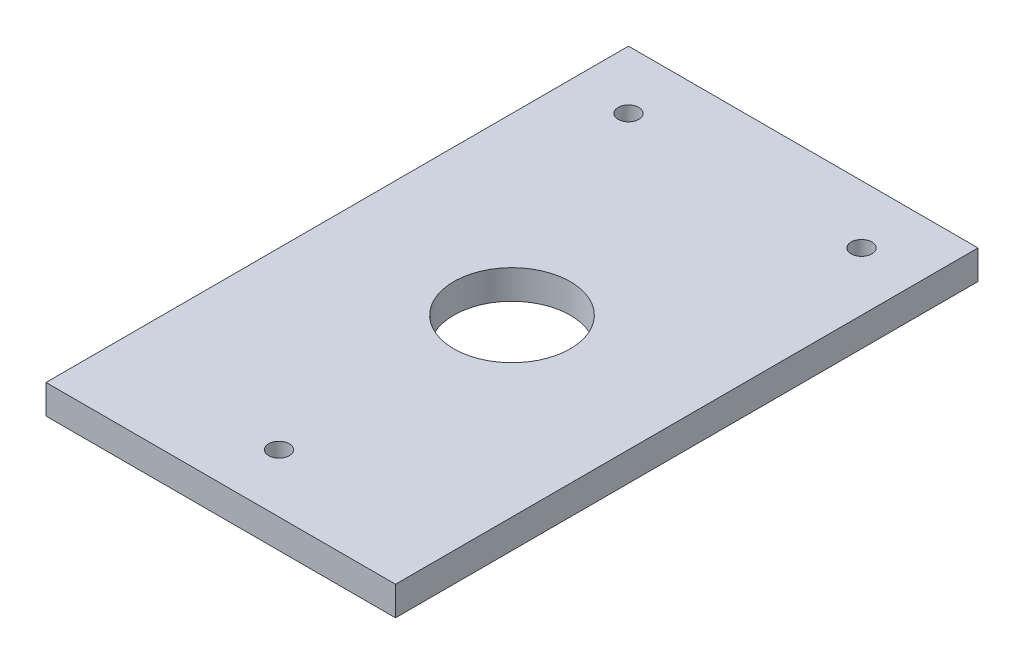
ISO-10303-21;
HEADER;
FILE_DESCRIPTION(('STEP AP214'),'2;1');
FILE_NAME('part.step','',(''),(''),'','','');
FILE_SCHEMA(('AUTOMOTIVE_DESIGN { 1 0 10303 214 1 1 1 1 }'));
ENDSEC;
DATA;
#1=APPLICATION_CONTEXT('core data for automotive mechanical design processes');
#2=APPLICATION_PROTOCOL_DEFINITION('international standard','automotive_design',2000,#1);
#3=PRODUCT_CONTEXT('',#1,'mechanical');
#4=PRODUCT('Part','Part','',(#3));
#5=PRODUCT_RELATED_PRODUCT_CATEGORY('part','',(#4));
#6=PRODUCT_DEFINITION_FORMATION('','',#4);
#7=PRODUCT_DEFINITION_CONTEXT('part definition',#1,'design');
#8=PRODUCT_DEFINITION('design','',#6,#7);
#9=PRODUCT_DEFINITION_SHAPE('','',#8);
#10=(LENGTH_UNIT() NAMED_UNIT(*) SI_UNIT(.MILLI.,.METRE.));
#11=(NAMED_UNIT(*) PLANE_ANGLE_UNIT() SI_UNIT($,.RADIAN.));
#12=(NAMED_UNIT(*) SI_UNIT($,.STERADIAN.) SOLID_ANGLE_UNIT());
#13=UNCERTAINTY_MEASURE_WITH_UNIT(LENGTH_MEASURE(1.E-05),#10,'distance_accuracy_value','');
#14=(GEOMETRIC_REPRESENTATION_CONTEXT(3) GLOBAL_UNCERTAINTY_ASSIGNED_CONTEXT((#13)) GLOBAL_UNIT_ASSIGNED_CONTEXT((#10,
#11,#12)) REPRESENTATION_CONTEXT('',''));
#15=CARTESIAN_POINT('',(0.,0.,0.));
#16=DIRECTION('',(0.,0.,1.));
#17=DIRECTION('',(1.,0.,0.));
#18=AXIS2_PLACEMENT_3D('',#15,#16,#17);
#19=CARTESIAN_POINT('',(0.,3.175,0.));
#20=DIRECTION('',(0.,1.,0.));
#21=DIRECTION('',(0.,0.,1.));
#22=AXIS2_PLACEMENT_3D('',#19,#20,#21);
#23=PLANE('',#22);
#24=CARTESIAN_POINT('',(-12.7,3.175,222.25));
#25=DIRECTION('',(0.,-1.,0.));
#26=DIRECTION('',(0.,0.,-1.));
#27=AXIS2_PLACEMENT_3D('',#24,#25,#26);
#28=CIRCLE('',#27,1.1303);
#29=CARTESIAN_POINT('',(-12.7,3.175,221.1197));
#30=VERTEX_POINT('',#29);
#31=EDGE_CURVE('E131',#30,#30,#28,.T.);
#32=ORIENTED_EDGE('',*,*,#31,.T.);
#33=EDGE_LOOP('',(#32));
#34=FACE_BOUND('',#33,.T.);
#35=CARTESIAN_POINT('',(12.7,3.175,222.25));
#36=DIRECTION('',(0.,-1.,0.));
#37=DIRECTION('',(0.,0.,-1.));
#38=AXIS2_PLACEMENT_3D('',#35,#36,#37);
#39=CIRCLE('',#38,1.1303);
#40=CARTESIAN_POINT('',(12.7,3.175,221.1197));
#41=VERTEX_POINT('',#40);
#42=EDGE_CURVE('E125',#41,#41,#39,.T.);
#43=ORIENTED_EDGE('',*,*,#42,.T.);
#44=EDGE_LOOP('',(#43));
#45=FACE_BOUND('',#44,.T.);
#46=CARTESIAN_POINT('',(0.,3.175,273.05));
#47=DIRECTION('',(0.,-1.,0.));
#48=DIRECTION('',(0.,0.,-1.));
#49=AXIS2_PLACEMENT_3D('',#46,#47,#48);
#50=CIRCLE('',#49,1.1303);
#51=CARTESIAN_POINT('',(0.,3.175,271.9197));
#52=VERTEX_POINT('',#51);
#53=EDGE_CURVE('E117',#52,#52,#50,.T.);
#54=ORIENTED_EDGE('',*,*,#53,.T.);
#55=EDGE_LOOP('',(#54));
#56=FACE_BOUND('',#55,.T.);
#57=DIRECTION('',(0.,0.,-1.));
#58=VECTOR('',#57,1.);
#59=CARTESIAN_POINT('',(19.05,3.175,279.4));
#60=LINE('',#59,#58);
#61=CARTESIAN_POINT('',(19.05,3.175,279.4));
#62=VERTEX_POINT('',#61);
#63=CARTESIAN_POINT('',(19.05,3.175,215.9));
#64=VERTEX_POINT('',#63);
#65=EDGE_CURVE('E87',#62,#64,#60,.T.);
#66=ORIENTED_EDGE('',*,*,#65,.T.);
#67=DIRECTION('',(-1.,0.,0.));
#68=VECTOR('',#67,1.);
#69=CARTESIAN_POINT('',(19.05,3.175,215.9));
#70=LINE('',#69,#68);
#71=CARTESIAN_POINT('',(-19.05,3.175,215.9));
#72=VERTEX_POINT('',#71);
#73=EDGE_CURVE('E82',#64,#72,#70,.T.);
#74=ORIENTED_EDGE('',*,*,#73,.T.);
#75=DIRECTION('',(0.,0.,1.));
#76=VECTOR('',#75,1.);
#77=CARTESIAN_POINT('',(-19.05,3.175,279.4));
#78=LINE('',#77,#76);
#79=CARTESIAN_POINT('',(-19.05,3.175,279.4));
#80=VERTEX_POINT('',#79);
#81=EDGE_CURVE('E85',#72,#80,#78,.T.);
#82=ORIENTED_EDGE('',*,*,#81,.T.);
#83=DIRECTION('',(1.,0.,0.));
#84=VECTOR('',#83,1.);
#85=CARTESIAN_POINT('',(19.05,3.175,279.4));
#86=LINE('',#85,#84);
#87=EDGE_CURVE('E52',#80,#62,#86,.T.);
#88=ORIENTED_EDGE('',*,*,#87,.T.);
#89=EDGE_LOOP('',(#66,#74,#82,#88));
#90=FACE_BOUND('',#89,.T.);
#91=CARTESIAN_POINT('',(0.,3.175,247.65));
#92=DIRECTION('',(0.,1.,0.));
#93=DIRECTION('',(0.,0.,1.));
#94=AXIS2_PLACEMENT_3D('',#91,#92,#93);
#95=CIRCLE('',#94,6.35);
#96=CARTESIAN_POINT('',(0.,3.175,254.));
#97=VERTEX_POINT('',#96);
#98=EDGE_CURVE('E102',#97,#97,#95,.T.);
#99=ORIENTED_EDGE('',*,*,#98,.F.);
#100=EDGE_LOOP('',(#99));
#101=FACE_BOUND('',#100,.T.);
#102=ADVANCED_FACE('F35',(#34,#45,#56,#90,#101),#23,.T.);
#103=CARTESIAN_POINT('',(0.,0.,0.));
#104=DIRECTION('',(0.,1.,0.));
#105=DIRECTION('',(0.,0.,1.));
#106=AXIS2_PLACEMENT_3D('',#103,#104,#105);
#107=PLANE('',#106);
#108=CARTESIAN_POINT('',(-12.7,0.,222.25));
#109=DIRECTION('',(0.,-1.,0.));
#110=DIRECTION('',(0.,0.,-1.));
#111=AXIS2_PLACEMENT_3D('',#108,#109,#110);
#112=CIRCLE('',#111,1.13029999999999);
#113=CARTESIAN_POINT('',(-12.7,0.,221.1197));
#114=VERTEX_POINT('',#113);
#115=EDGE_CURVE('E134',#114,#114,#112,.T.);
#116=ORIENTED_EDGE('',*,*,#115,.F.);
#117=EDGE_LOOP('',(#116));
#118=FACE_BOUND('',#117,.T.);
#119=CARTESIAN_POINT('',(12.7,0.,222.25));
#120=DIRECTION('',(0.,-1.,0.));
#121=DIRECTION('',(0.,0.,-1.));
#122=AXIS2_PLACEMENT_3D('',#119,#120,#121);
#123=CIRCLE('',#122,1.13029999999999);
#124=CARTESIAN_POINT('',(12.7,0.,221.1197));
#125=VERTEX_POINT('',#124);
#126=EDGE_CURVE('E128',#125,#125,#123,.T.);
#127=ORIENTED_EDGE('',*,*,#126,.F.);
#128=EDGE_LOOP('',(#127));
#129=FACE_BOUND('',#128,.T.);
#130=CARTESIAN_POINT('',(0.,0.,273.05));
#131=DIRECTION('',(0.,-1.,0.));
#132=DIRECTION('',(0.,0.,-1.));
#133=AXIS2_PLACEMENT_3D('',#130,#131,#132);
#134=CIRCLE('',#133,1.13029999999999);
#135=CARTESIAN_POINT('',(0.,0.,271.9197));
#136=VERTEX_POINT('',#135);
#137=EDGE_CURVE('E122',#136,#136,#134,.T.);
#138=ORIENTED_EDGE('',*,*,#137,.F.);
#139=EDGE_LOOP('',(#138));
#140=FACE_BOUND('',#139,.T.);
#141=DIRECTION('',(0.,0.,-1.));
#142=VECTOR('',#141,1.);
#143=CARTESIAN_POINT('',(19.05,0.,279.4));
#144=LINE('',#143,#142);
#145=CARTESIAN_POINT('',(19.05,0.,279.4));
#146=VERTEX_POINT('',#145);
#147=CARTESIAN_POINT('',(19.05,0.,215.9));
#148=VERTEX_POINT('',#147);
#149=EDGE_CURVE('E99',#146,#148,#144,.T.);
#150=ORIENTED_EDGE('',*,*,#149,.F.);
#151=DIRECTION('',(1.,0.,0.));
#152=VECTOR('',#151,1.);
#153=CARTESIAN_POINT('',(19.05,0.,279.4));
#154=LINE('',#153,#152);
#155=CARTESIAN_POINT('',(-19.05,0.,279.4));
#156=VERTEX_POINT('',#155);
#157=EDGE_CURVE('E75',#156,#146,#154,.T.);
#158=ORIENTED_EDGE('',*,*,#157,.F.);
#159=DIRECTION('',(0.,0.,1.));
#160=VECTOR('',#159,1.);
#161=CARTESIAN_POINT('',(-19.05,0.,279.4));
#162=LINE('',#161,#160);
#163=CARTESIAN_POINT('',(-19.05,0.,215.9));
#164=VERTEX_POINT('',#163);
#165=EDGE_CURVE('E69',#164,#156,#162,.T.);
#166=ORIENTED_EDGE('',*,*,#165,.F.);
#167=DIRECTION('',(-1.,0.,0.));
#168=VECTOR('',#167,1.);
#169=CARTESIAN_POINT('',(19.05,0.,215.9));
#170=LINE('',#169,#168);
#171=EDGE_CURVE('E91',#148,#164,#170,.T.);
#172=ORIENTED_EDGE('',*,*,#171,.F.);
#173=EDGE_LOOP('',(#150,#158,#166,#172));
#174=FACE_BOUND('',#173,.T.);
#175=CARTESIAN_POINT('',(0.,0.,247.65));
#176=DIRECTION('',(0.,1.,0.));
#177=DIRECTION('',(0.,0.,1.));
#178=AXIS2_PLACEMENT_3D('',#175,#176,#177);
#179=CIRCLE('',#178,6.35);
#180=CARTESIAN_POINT('',(0.,0.,254.));
#181=VERTEX_POINT('',#180);
#182=EDGE_CURVE('E114',#181,#181,#179,.T.);
#183=ORIENTED_EDGE('',*,*,#182,.T.);
#184=EDGE_LOOP('',(#183));
#185=FACE_BOUND('',#184,.T.);
#186=ADVANCED_FACE('F110',(#118,#129,#140,#174,#185),#107,.F.);
#187=CARTESIAN_POINT('',(19.05,3.175,279.4));
#188=DIRECTION('',(-1.,0.,0.));
#189=DIRECTION('',(0.,0.,1.));
#190=AXIS2_PLACEMENT_3D('',#187,#188,#189);
#191=PLANE('',#190);
#192=ORIENTED_EDGE('',*,*,#149,.T.);
#193=DIRECTION('',(0.,-1.,0.));
#194=VECTOR('',#193,1.);
#195=CARTESIAN_POINT('',(19.05,3.175,215.9));
#196=LINE('',#195,#194);
#197=EDGE_CURVE('E11',#64,#148,#196,.T.);
#198=ORIENTED_EDGE('',*,*,#197,.F.);
#199=ORIENTED_EDGE('',*,*,#65,.F.);
#200=DIRECTION('',(0.,-1.,0.));
#201=VECTOR('',#200,1.);
#202=CARTESIAN_POINT('',(19.05,3.175,279.4));
#203=LINE('',#202,#201);
#204=EDGE_CURVE('E95',#62,#146,#203,.T.);
#205=ORIENTED_EDGE('',*,*,#204,.T.);
#206=EDGE_LOOP('',(#192,#198,#199,#205));
#207=FACE_BOUND('',#206,.T.);
#208=ADVANCED_FACE('F37',(#207),#191,.F.);
#209=CARTESIAN_POINT('',(19.05,3.175,215.9));
#210=DIRECTION('',(0.,0.,1.));
#211=DIRECTION('',(1.,0.,0.));
#212=AXIS2_PLACEMENT_3D('',#209,#210,#211);
#213=PLANE('',#212);
#214=ORIENTED_EDGE('',*,*,#171,.T.);
#215=DIRECTION('',(0.,-1.,0.));
#216=VECTOR('',#215,1.);
#217=CARTESIAN_POINT('',(-19.05,3.175,215.9));
#218=LINE('',#217,#216);
#219=EDGE_CURVE('E44',#72,#164,#218,.T.);
#220=ORIENTED_EDGE('',*,*,#219,.F.);
#221=ORIENTED_EDGE('',*,*,#73,.F.);
#222=ORIENTED_EDGE('',*,*,#197,.T.);
#223=EDGE_LOOP('',(#214,#220,#221,#222));
#224=FACE_BOUND('',#223,.T.);
#225=ADVANCED_FACE('F90',(#224),#213,.F.);
#226=CARTESIAN_POINT('',(-19.05,3.175,279.4));
#227=DIRECTION('',(1.,0.,0.));
#228=DIRECTION('',(0.,0.,-1.));
#229=AXIS2_PLACEMENT_3D('',#226,#227,#228);
#230=PLANE('',#229);
#231=ORIENTED_EDGE('',*,*,#165,.T.);
#232=DIRECTION('',(0.,-1.,0.));
#233=VECTOR('',#232,1.);
#234=CARTESIAN_POINT('',(-19.05,3.175,279.4));
#235=LINE('',#234,#233);
#236=EDGE_CURVE('E92',#80,#156,#235,.T.);
#237=ORIENTED_EDGE('',*,*,#236,.F.);
#238=ORIENTED_EDGE('',*,*,#81,.F.);
#239=ORIENTED_EDGE('',*,*,#219,.T.);
#240=EDGE_LOOP('',(#231,#237,#238,#239));
#241=FACE_BOUND('',#240,.T.);
#242=ADVANCED_FACE('F93',(#241),#230,.F.);
#243=CARTESIAN_POINT('',(19.05,3.175,279.4));
#244=DIRECTION('',(0.,0.,-1.));
#245=DIRECTION('',(-1.,0.,0.));
#246=AXIS2_PLACEMENT_3D('',#243,#244,#245);
#247=PLANE('',#246);
#248=ORIENTED_EDGE('',*,*,#157,.T.);
#249=ORIENTED_EDGE('',*,*,#204,.F.);
#250=ORIENTED_EDGE('',*,*,#87,.F.);
#251=ORIENTED_EDGE('',*,*,#236,.T.);
#252=EDGE_LOOP('',(#248,#249,#250,#251));
#253=FACE_BOUND('',#252,.T.);
#254=ADVANCED_FACE('F107',(#253),#247,.F.);
#255=CARTESIAN_POINT('',(0.,3.175,247.65));
#256=DIRECTION('',(0.,-1.,0.));
#257=DIRECTION('',(0.,0.,-1.));
#258=AXIS2_PLACEMENT_3D('',#255,#256,#257);
#259=CYLINDRICAL_SURFACE('',#258,6.35);
#260=ORIENTED_EDGE('',*,*,#98,.T.);
#261=EDGE_LOOP('',(#260));
#262=FACE_BOUND('',#261,.T.);
#263=ORIENTED_EDGE('',*,*,#182,.F.);
#264=EDGE_LOOP('',(#263));
#265=FACE_BOUND('',#264,.T.);
#266=ADVANCED_FACE('F150',(#262,#265),#259,.F.);
#267=CARTESIAN_POINT('',(0.,0.,273.05));
#268=DIRECTION('',(0.,-1.,0.));
#269=DIRECTION('',(0.,0.,-1.));
#270=AXIS2_PLACEMENT_3D('',#267,#268,#269);
#271=CYLINDRICAL_SURFACE('',#270,1.13029999999999);
#272=ORIENTED_EDGE('',*,*,#53,.F.);
#273=EDGE_LOOP('',(#272));
#274=FACE_BOUND('',#273,.T.);
#275=ORIENTED_EDGE('',*,*,#137,.T.);
#276=EDGE_LOOP('',(#275));
#277=FACE_BOUND('',#276,.T.);
#278=ADVANCED_FACE('F147',(#274,#277),#271,.F.);
#279=CARTESIAN_POINT('',(12.7,0.,222.25));
#280=DIRECTION('',(0.,-1.,0.));
#281=DIRECTION('',(0.,0.,-1.));
#282=AXIS2_PLACEMENT_3D('',#279,#280,#281);
#283=CYLINDRICAL_SURFACE('',#282,1.13029999999999);
#284=ORIENTED_EDGE('',*,*,#42,.F.);
#285=EDGE_LOOP('',(#284));
#286=FACE_BOUND('',#285,.T.);
#287=ORIENTED_EDGE('',*,*,#126,.T.);
#288=EDGE_LOOP('',(#287));
#289=FACE_BOUND('',#288,.T.);
#290=ADVANCED_FACE('F149',(#286,#289),#283,.F.);
#291=CARTESIAN_POINT('',(-12.7,0.,222.25));
#292=DIRECTION('',(0.,-1.,0.));
#293=DIRECTION('',(0.,0.,-1.));
#294=AXIS2_PLACEMENT_3D('',#291,#292,#293);
#295=CYLINDRICAL_SURFACE('',#294,1.13029999999999);
#296=ORIENTED_EDGE('',*,*,#31,.F.);
#297=EDGE_LOOP('',(#296));
#298=FACE_BOUND('',#297,.T.);
#299=ORIENTED_EDGE('',*,*,#115,.T.);
#300=EDGE_LOOP('',(#299));
#301=FACE_BOUND('',#300,.T.);
#302=ADVANCED_FACE('F138',(#298,#301),#295,.F.);
#303=CLOSED_SHELL('',(#102,#186,#208,#225,#242,#254,#266,#278,#290,#302));
#304=MANIFOLD_SOLID_BREP('B2',#303);
#305=ADVANCED_BREP_SHAPE_REPRESENTATION('',(#18,#304),#14);
#306=SHAPE_DEFINITION_REPRESENTATION(#9,#305);
ENDSEC;
END-ISO-10303-21;
